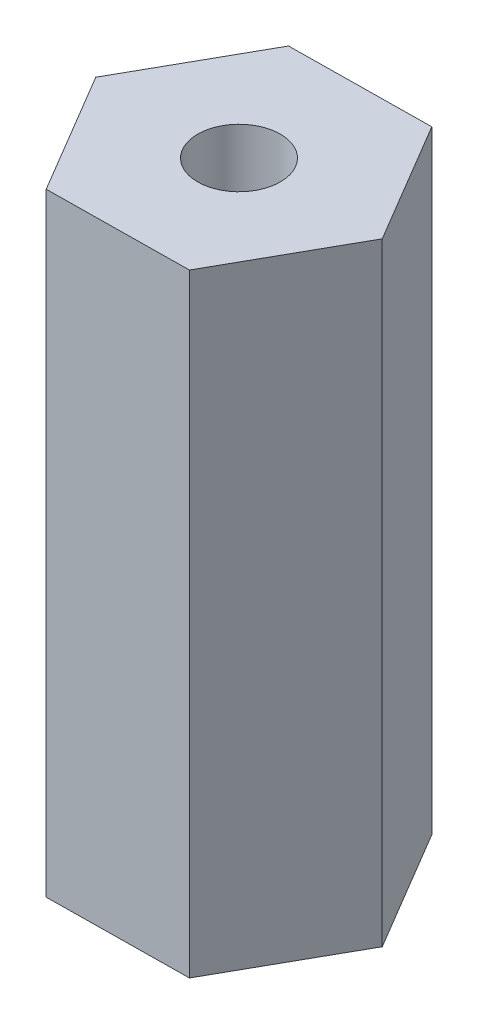
ISO-10303-21;
HEADER;
FILE_DESCRIPTION(('STEP AP214'),'2;1');
FILE_NAME('part.step','',(''),(''),'','','');
FILE_SCHEMA(('AUTOMOTIVE_DESIGN { 1 0 10303 214 1 1 1 1 }'));
ENDSEC;
DATA;
#1=APPLICATION_CONTEXT('core data for automotive mechanical design processes');
#2=APPLICATION_PROTOCOL_DEFINITION('international standard','automotive_design',2000,#1);
#3=PRODUCT_CONTEXT('',#1,'mechanical');
#4=PRODUCT('Part','Part','',(#3));
#5=PRODUCT_RELATED_PRODUCT_CATEGORY('part','',(#4));
#6=PRODUCT_DEFINITION_FORMATION('','',#4);
#7=PRODUCT_DEFINITION_CONTEXT('part definition',#1,'design');
#8=PRODUCT_DEFINITION('design','',#6,#7);
#9=PRODUCT_DEFINITION_SHAPE('','',#8);
#10=(LENGTH_UNIT() NAMED_UNIT(*) SI_UNIT(.MILLI.,.METRE.));
#11=(NAMED_UNIT(*) PLANE_ANGLE_UNIT() SI_UNIT($,.RADIAN.));
#12=(NAMED_UNIT(*) SI_UNIT($,.STERADIAN.) SOLID_ANGLE_UNIT());
#13=UNCERTAINTY_MEASURE_WITH_UNIT(LENGTH_MEASURE(1.E-05),#10,'distance_accuracy_value','');
#14=(GEOMETRIC_REPRESENTATION_CONTEXT(3) GLOBAL_UNCERTAINTY_ASSIGNED_CONTEXT((#13)) GLOBAL_UNIT_ASSIGNED_CONTEXT((#10,
#11,#12)) REPRESENTATION_CONTEXT('',''));
#15=CARTESIAN_POINT('',(0.,0.,0.));
#16=DIRECTION('',(0.,0.,1.));
#17=DIRECTION('',(1.,0.,0.));
#18=AXIS2_PLACEMENT_3D('',#15,#16,#17);
#19=CARTESIAN_POINT('',(-3.3933965684671,30.,6.0402698390979));
#20=DIRECTION('',(-0.0117443561392562,0.,-0.999931032671191));
#21=DIRECTION('',(-0.999931032671191,0.,0.0117443561392562));
#22=AXIS2_PLACEMENT_3D('',#19,#20,#21);
#23=PLANE('',#22);
#24=DIRECTION('',(0.999931032671191,0.,-0.0117443561392562));
#25=VECTOR('',#24,1.);
#26=CARTESIAN_POINT('',(-3.3933965684671,0.,6.0402698390979));
#27=LINE('',#26,#25);
#28=CARTESIAN_POINT('',(-3.3933965684671,0.,6.0402698390979));
#29=VERTEX_POINT('',#28);
#30=CARTESIAN_POINT('',(3.53432884213817,0.,5.9589025529564));
#31=VERTEX_POINT('',#30);
#32=EDGE_CURVE('E123',#29,#31,#27,.T.);
#33=ORIENTED_EDGE('',*,*,#32,.T.);
#34=DIRECTION('',(0.,-1.,0.));
#35=VECTOR('',#34,1.);
#36=CARTESIAN_POINT('',(3.53432884213817,30.,5.9589025529564));
#37=LINE('',#36,#35);
#38=CARTESIAN_POINT('',(3.53432884213817,30.,5.9589025529564));
#39=VERTEX_POINT('',#38);
#40=EDGE_CURVE('E11',#39,#31,#37,.T.);
#41=ORIENTED_EDGE('',*,*,#40,.F.);
#42=DIRECTION('',(0.999931032671191,0.,-0.0117443561392562));
#43=VECTOR('',#42,1.);
#44=CARTESIAN_POINT('',(-3.3933965684671,30.,6.0402698390979));
#45=LINE('',#44,#43);
#46=CARTESIAN_POINT('',(-3.3933965684671,30.,6.0402698390979));
#47=VERTEX_POINT('',#46);
#48=EDGE_CURVE('E134',#47,#39,#45,.T.);
#49=ORIENTED_EDGE('',*,*,#48,.F.);
#50=DIRECTION('',(0.,-1.,0.));
#51=VECTOR('',#50,1.);
#52=CARTESIAN_POINT('',(-3.3933965684671,30.,6.0402698390979));
#53=LINE('',#52,#51);
#54=EDGE_CURVE('E119',#47,#29,#53,.T.);
#55=ORIENTED_EDGE('',*,*,#54,.T.);
#56=EDGE_LOOP('',(#33,#41,#49,#55));
#57=FACE_BOUND('',#56,.T.);
#58=ADVANCED_FACE('F39',(#57),#23,.F.);
#59=CARTESIAN_POINT('',(3.53432884213817,30.,5.9589025529564));
#60=DIRECTION('',(-0.871837854395287,0.,-0.489794605567908));
#61=DIRECTION('',(-0.489794605567908,0.,0.871837854395287));
#62=AXIS2_PLACEMENT_3D('',#59,#60,#61);
#63=PLANE('',#62);
#64=DIRECTION('',(0.489794605567908,0.,-0.871837854395287));
#65=VECTOR('',#64,1.);
#66=CARTESIAN_POINT('',(3.53432884213817,0.,5.9589025529564));
#67=LINE('',#66,#65);
#68=CARTESIAN_POINT('',(6.92772541060527,0.,-0.0813672861415009));
#69=VERTEX_POINT('',#68);
#70=EDGE_CURVE('E126',#31,#69,#67,.T.);
#71=ORIENTED_EDGE('',*,*,#70,.T.);
#72=DIRECTION('',(0.,-1.,0.));
#73=VECTOR('',#72,1.);
#74=CARTESIAN_POINT('',(6.92772541060527,30.,-0.0813672861415009));
#75=LINE('',#74,#73);
#76=CARTESIAN_POINT('',(6.92772541060527,30.,-0.0813672861415009));
#77=VERTEX_POINT('',#76);
#78=EDGE_CURVE('E47',#77,#69,#75,.T.);
#79=ORIENTED_EDGE('',*,*,#78,.F.);
#80=DIRECTION('',(0.489794605567908,0.,-0.871837854395287));
#81=VECTOR('',#80,1.);
#82=CARTESIAN_POINT('',(3.53432884213817,30.,5.9589025529564));
#83=LINE('',#82,#81);
#84=EDGE_CURVE('E92',#39,#77,#83,.T.);
#85=ORIENTED_EDGE('',*,*,#84,.F.);
#86=ORIENTED_EDGE('',*,*,#40,.T.);
#87=EDGE_LOOP('',(#71,#79,#85,#86));
#88=FACE_BOUND('',#87,.T.);
#89=ADVANCED_FACE('F160',(#88),#63,.F.);
#90=CARTESIAN_POINT('',(6.92772541060527,30.,-0.0813672861415009));
#91=DIRECTION('',(-0.860093498256031,0.,0.510136427103283));
#92=DIRECTION('',(0.510136427103283,0.,0.860093498256031));
#93=AXIS2_PLACEMENT_3D('',#90,#91,#92);
#94=PLANE('',#93);
#95=DIRECTION('',(-0.510136427103283,0.,-0.860093498256031));
#96=VECTOR('',#95,1.);
#97=CARTESIAN_POINT('',(6.92772541060527,0.,-0.0813672861415009));
#98=LINE('',#97,#96);
#99=CARTESIAN_POINT('',(3.3933965684671,0.,-6.0402698390979));
#100=VERTEX_POINT('',#99);
#101=EDGE_CURVE('E129',#69,#100,#98,.T.);
#102=ORIENTED_EDGE('',*,*,#101,.T.);
#103=DIRECTION('',(0.,-1.,0.));
#104=VECTOR('',#103,1.);
#105=CARTESIAN_POINT('',(3.3933965684671,30.,-6.0402698390979));
#106=LINE('',#105,#104);
#107=CARTESIAN_POINT('',(3.3933965684671,30.,-6.0402698390979));
#108=VERTEX_POINT('',#107);
#109=EDGE_CURVE('E114',#108,#100,#106,.T.);
#110=ORIENTED_EDGE('',*,*,#109,.F.);
#111=DIRECTION('',(-0.510136427103283,0.,-0.860093498256031));
#112=VECTOR('',#111,1.);
#113=CARTESIAN_POINT('',(6.92772541060527,30.,-0.0813672861415009));
#114=LINE('',#113,#112);
#115=EDGE_CURVE('E105',#77,#108,#114,.T.);
#116=ORIENTED_EDGE('',*,*,#115,.F.);
#117=ORIENTED_EDGE('',*,*,#78,.T.);
#118=EDGE_LOOP('',(#102,#110,#116,#117));
#119=FACE_BOUND('',#118,.T.);
#120=ADVANCED_FACE('F140',(#119),#94,.F.);
#121=CARTESIAN_POINT('',(3.3933965684671,30.,-6.0402698390979));
#122=DIRECTION('',(0.011744356139256,0.,0.999931032671191));
#123=DIRECTION('',(0.999931032671191,0.,-0.011744356139256));
#124=AXIS2_PLACEMENT_3D('',#121,#122,#123);
#125=PLANE('',#124);
#126=DIRECTION('',(-0.999931032671191,0.,0.011744356139256));
#127=VECTOR('',#126,1.);
#128=CARTESIAN_POINT('',(3.3933965684671,0.,-6.0402698390979));
#129=LINE('',#128,#127);
#130=CARTESIAN_POINT('',(-3.53432884213817,0.,-5.9589025529564));
#131=VERTEX_POINT('',#130);
#132=EDGE_CURVE('E113',#100,#131,#129,.T.);
#133=ORIENTED_EDGE('',*,*,#132,.T.);
#134=DIRECTION('',(0.,-1.,0.));
#135=VECTOR('',#134,1.);
#136=CARTESIAN_POINT('',(-3.53432884213817,30.,-5.9589025529564));
#137=LINE('',#136,#135);
#138=CARTESIAN_POINT('',(-3.53432884213817,30.,-5.9589025529564));
#139=VERTEX_POINT('',#138);
#140=EDGE_CURVE('E110',#139,#131,#137,.T.);
#141=ORIENTED_EDGE('',*,*,#140,.F.);
#142=DIRECTION('',(-0.999931032671191,0.,0.011744356139256));
#143=VECTOR('',#142,1.);
#144=CARTESIAN_POINT('',(3.3933965684671,30.,-6.0402698390979));
#145=LINE('',#144,#143);
#146=EDGE_CURVE('E99',#108,#139,#145,.T.);
#147=ORIENTED_EDGE('',*,*,#146,.F.);
#148=ORIENTED_EDGE('',*,*,#109,.T.);
#149=EDGE_LOOP('',(#133,#141,#147,#148));
#150=FACE_BOUND('',#149,.T.);
#151=ADVANCED_FACE('F111',(#150),#125,.F.);
#152=CARTESIAN_POINT('',(-3.53432884213817,30.,-5.9589025529564));
#153=DIRECTION('',(0.871837854395287,0.,0.489794605567908));
#154=DIRECTION('',(0.489794605567908,0.,-0.871837854395287));
#155=AXIS2_PLACEMENT_3D('',#152,#153,#154);
#156=PLANE('',#155);
#157=DIRECTION('',(-0.489794605567908,0.,0.871837854395287));
#158=VECTOR('',#157,1.);
#159=CARTESIAN_POINT('',(-3.53432884213817,0.,-5.9589025529564));
#160=LINE('',#159,#158);
#161=CARTESIAN_POINT('',(-6.92772541060527,0.,0.0813672861414988));
#162=VERTEX_POINT('',#161);
#163=EDGE_CURVE('E78',#131,#162,#160,.T.);
#164=ORIENTED_EDGE('',*,*,#163,.T.);
#165=DIRECTION('',(0.,-1.,0.));
#166=VECTOR('',#165,1.);
#167=CARTESIAN_POINT('',(-6.92772541060527,30.,0.0813672861414988));
#168=LINE('',#167,#166);
#169=CARTESIAN_POINT('',(-6.92772541060527,30.,0.0813672861414988));
#170=VERTEX_POINT('',#169);
#171=EDGE_CURVE('E115',#170,#162,#168,.T.);
#172=ORIENTED_EDGE('',*,*,#171,.F.);
#173=DIRECTION('',(-0.489794605567908,0.,0.871837854395287));
#174=VECTOR('',#173,1.);
#175=CARTESIAN_POINT('',(-3.53432884213817,30.,-5.9589025529564));
#176=LINE('',#175,#174);
#177=EDGE_CURVE('E103',#139,#170,#176,.T.);
#178=ORIENTED_EDGE('',*,*,#177,.F.);
#179=ORIENTED_EDGE('',*,*,#140,.T.);
#180=EDGE_LOOP('',(#164,#172,#178,#179));
#181=FACE_BOUND('',#180,.T.);
#182=ADVANCED_FACE('F117',(#181),#156,.F.);
#183=CARTESIAN_POINT('',(-6.92772541060527,30.,0.0813672861414988));
#184=DIRECTION('',(0.860093498256031,0.,-0.510136427103283));
#185=DIRECTION('',(-0.510136427103283,0.,-0.860093498256031));
#186=AXIS2_PLACEMENT_3D('',#183,#184,#185);
#187=PLANE('',#186);
#188=DIRECTION('',(0.510136427103283,0.,0.860093498256031));
#189=VECTOR('',#188,1.);
#190=CARTESIAN_POINT('',(-6.92772541060527,0.,0.0813672861414988));
#191=LINE('',#190,#189);
#192=EDGE_CURVE('E84',#162,#29,#191,.T.);
#193=ORIENTED_EDGE('',*,*,#192,.T.);
#194=ORIENTED_EDGE('',*,*,#54,.F.);
#195=DIRECTION('',(0.510136427103283,0.,0.860093498256031));
#196=VECTOR('',#195,1.);
#197=CARTESIAN_POINT('',(-6.92772541060527,30.,0.0813672861414988));
#198=LINE('',#197,#196);
#199=EDGE_CURVE('E55',#170,#47,#198,.T.);
#200=ORIENTED_EDGE('',*,*,#199,.F.);
#201=ORIENTED_EDGE('',*,*,#171,.T.);
#202=EDGE_LOOP('',(#193,#194,#200,#201));
#203=FACE_BOUND('',#202,.T.);
#204=ADVANCED_FACE('F147',(#203),#187,.F.);
#205=CARTESIAN_POINT('',(0.,30.,0.));
#206=DIRECTION('',(0.,1.,0.));
#207=DIRECTION('',(0.,0.,1.));
#208=AXIS2_PLACEMENT_3D('',#205,#206,#207);
#209=PLANE('',#208);
#210=CARTESIAN_POINT('',(0.,30.,0.));
#211=DIRECTION('',(0.,1.,0.));
#212=DIRECTION('',(0.,0.,1.));
#213=AXIS2_PLACEMENT_3D('',#210,#211,#212);
#214=CIRCLE('',#213,2.025);
#215=CARTESIAN_POINT('',(0.,30.,2.025));
#216=VERTEX_POINT('',#215);
#217=EDGE_CURVE('E221',#216,#216,#214,.T.);
#218=ORIENTED_EDGE('',*,*,#217,.F.);
#219=EDGE_LOOP('',(#218));
#220=FACE_BOUND('',#219,.T.);
#221=ORIENTED_EDGE('',*,*,#48,.T.);
#222=ORIENTED_EDGE('',*,*,#84,.T.);
#223=ORIENTED_EDGE('',*,*,#115,.T.);
#224=ORIENTED_EDGE('',*,*,#146,.T.);
#225=ORIENTED_EDGE('',*,*,#177,.T.);
#226=ORIENTED_EDGE('',*,*,#199,.T.);
#227=EDGE_LOOP('',(#221,#222,#223,#224,#225,#226));
#228=FACE_BOUND('',#227,.T.);
#229=ADVANCED_FACE('F101',(#220,#228),#209,.T.);
#230=CARTESIAN_POINT('',(0.,0.,0.));
#231=DIRECTION('',(0.,1.,0.));
#232=DIRECTION('',(0.,0.,1.));
#233=AXIS2_PLACEMENT_3D('',#230,#231,#232);
#234=PLANE('',#233);
#235=ORIENTED_EDGE('',*,*,#32,.F.);
#236=ORIENTED_EDGE('',*,*,#192,.F.);
#237=ORIENTED_EDGE('',*,*,#163,.F.);
#238=ORIENTED_EDGE('',*,*,#132,.F.);
#239=ORIENTED_EDGE('',*,*,#101,.F.);
#240=ORIENTED_EDGE('',*,*,#70,.F.);
#241=EDGE_LOOP('',(#235,#236,#237,#238,#239,#240));
#242=FACE_BOUND('',#241,.T.);
#243=ADVANCED_FACE('F143',(#242),#234,.F.);
#244=CARTESIAN_POINT('',(0.,12.,0.));
#245=DIRECTION('',(0.,1.,0.));
#246=DIRECTION('',(0.,0.,1.));
#247=AXIS2_PLACEMENT_3D('',#244,#245,#246);
#248=CYLINDRICAL_SURFACE('',#247,2.025);
#249=CARTESIAN_POINT('',(0.,12.,0.));
#250=DIRECTION('',(0.,1.,0.));
#251=DIRECTION('',(0.,0.,1.));
#252=AXIS2_PLACEMENT_3D('',#249,#250,#251);
#253=CIRCLE('',#252,2.025);
#254=CARTESIAN_POINT('',(0.,12.,2.025));
#255=VERTEX_POINT('',#254);
#256=EDGE_CURVE('E127',#255,#255,#253,.T.);
#257=ORIENTED_EDGE('',*,*,#256,.F.);
#258=EDGE_LOOP('',(#257));
#259=FACE_BOUND('',#258,.T.);
#260=ORIENTED_EDGE('',*,*,#217,.T.);
#261=EDGE_LOOP('',(#260));
#262=FACE_BOUND('',#261,.T.);
#263=ADVANCED_FACE('F199',(#259,#262),#248,.F.);
#264=CARTESIAN_POINT('',(0.,12.,0.));
#265=DIRECTION('',(0.,1.,0.));
#266=DIRECTION('',(0.,0.,1.));
#267=AXIS2_PLACEMENT_3D('',#264,#265,#266);
#268=PLANE('',#267);
#269=ORIENTED_EDGE('',*,*,#256,.T.);
#270=EDGE_LOOP('',(#269));
#271=FACE_BOUND('',#270,.T.);
#272=ADVANCED_FACE('F206',(#271),#268,.T.);
#273=CLOSED_SHELL('',(#58,#89,#120,#151,#182,#204,#229,#243,#263,#272));
#274=MANIFOLD_SOLID_BREP('B2',#273);
#275=ADVANCED_BREP_SHAPE_REPRESENTATION('',(#18,#274),#14);
#276=SHAPE_DEFINITION_REPRESENTATION(#9,#275);
ENDSEC;
END-ISO-10303-21;
